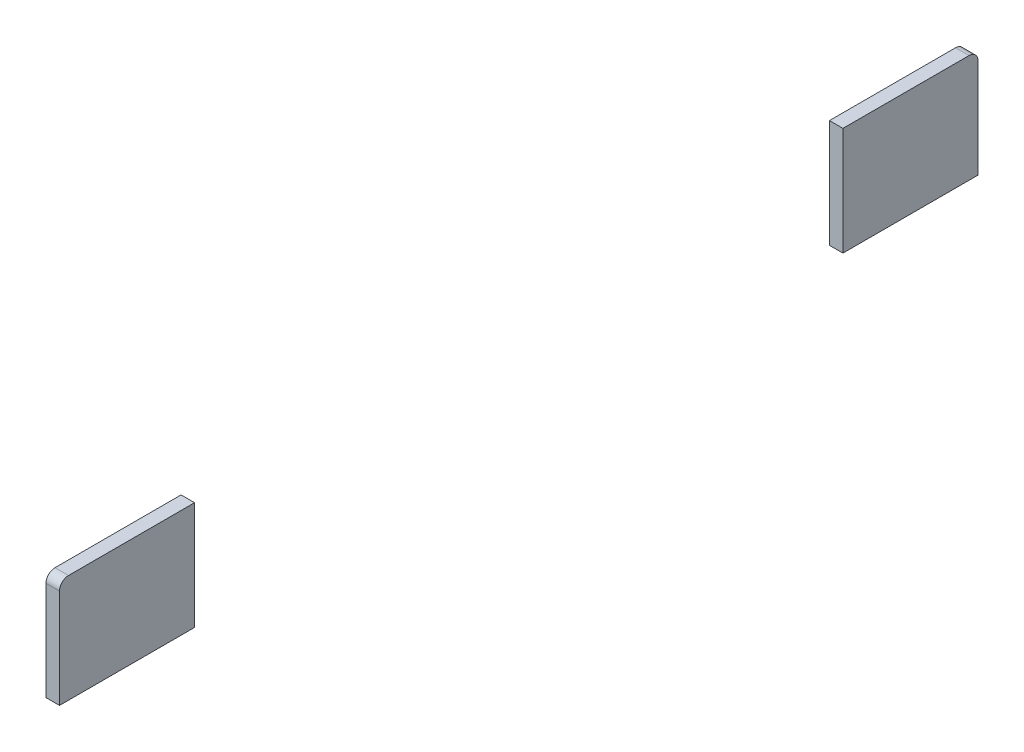
ISO-10303-21;
HEADER;
FILE_DESCRIPTION(('STEP AP214'),'2;1');
FILE_NAME('part.step','',(''),(''),'','','');
FILE_SCHEMA(('AUTOMOTIVE_DESIGN { 1 0 10303 214 1 1 1 1 }'));
ENDSEC;
DATA;
#1=APPLICATION_CONTEXT('core data for automotive mechanical design processes');
#2=APPLICATION_PROTOCOL_DEFINITION('international standard','automotive_design',2000,#1);
#3=PRODUCT_CONTEXT('',#1,'mechanical');
#4=PRODUCT('Part','Part','',(#3));
#5=PRODUCT_RELATED_PRODUCT_CATEGORY('part','',(#4));
#6=PRODUCT_DEFINITION_FORMATION('','',#4);
#7=PRODUCT_DEFINITION_CONTEXT('part definition',#1,'design');
#8=PRODUCT_DEFINITION('design','',#6,#7);
#9=PRODUCT_DEFINITION_SHAPE('','',#8);
#10=(LENGTH_UNIT() NAMED_UNIT(*) SI_UNIT(.MILLI.,.METRE.));
#11=(NAMED_UNIT(*) PLANE_ANGLE_UNIT() SI_UNIT($,.RADIAN.));
#12=(NAMED_UNIT(*) SI_UNIT($,.STERADIAN.) SOLID_ANGLE_UNIT());
#13=UNCERTAINTY_MEASURE_WITH_UNIT(LENGTH_MEASURE(1.E-05),#10,'distance_accuracy_value','');
#14=(GEOMETRIC_REPRESENTATION_CONTEXT(3) GLOBAL_UNCERTAINTY_ASSIGNED_CONTEXT((#13)) GLOBAL_UNIT_ASSIGNED_CONTEXT((#10,
#11,#12)) REPRESENTATION_CONTEXT('',''));
#15=CARTESIAN_POINT('',(0.,0.,0.));
#16=DIRECTION('',(0.,0.,1.));
#17=DIRECTION('',(1.,0.,0.));
#18=AXIS2_PLACEMENT_3D('',#15,#16,#17);
#19=CARTESIAN_POINT('',(1.5,0.,72.));
#20=DIRECTION('',(0.,0.,1.));
#21=DIRECTION('',(1.,0.,0.));
#22=AXIS2_PLACEMENT_3D('',#19,#20,#21);
#23=PLANE('',#22);
#24=DIRECTION('',(0.,1.,0.));
#25=VECTOR('',#24,1.);
#26=CARTESIAN_POINT('',(0.,0.,72.));
#27=LINE('',#26,#25);
#28=CARTESIAN_POINT('',(0.,0.,72.));
#29=VERTEX_POINT('',#28);
#30=CARTESIAN_POINT('',(0.,12.,72.));
#31=VERTEX_POINT('',#30);
#32=EDGE_CURVE('E117',#29,#31,#27,.T.);
#33=ORIENTED_EDGE('',*,*,#32,.T.);
#34=DIRECTION('',(-1.,0.,0.));
#35=VECTOR('',#34,1.);
#36=CARTESIAN_POINT('',(1.5,12.,72.));
#37=LINE('',#36,#35);
#38=CARTESIAN_POINT('',(1.5,12.,72.));
#39=VERTEX_POINT('',#38);
#40=EDGE_CURVE('E12',#39,#31,#37,.T.);
#41=ORIENTED_EDGE('',*,*,#40,.F.);
#42=DIRECTION('',(0.,1.,0.));
#43=VECTOR('',#42,1.);
#44=CARTESIAN_POINT('',(1.5,0.,72.));
#45=LINE('',#44,#43);
#46=CARTESIAN_POINT('',(1.5,0.,72.));
#47=VERTEX_POINT('',#46);
#48=EDGE_CURVE('E125',#47,#39,#45,.T.);
#49=ORIENTED_EDGE('',*,*,#48,.F.);
#50=DIRECTION('',(-1.,0.,0.));
#51=VECTOR('',#50,1.);
#52=CARTESIAN_POINT('',(1.5,0.,72.));
#53=LINE('',#52,#51);
#54=EDGE_CURVE('E113',#47,#29,#53,.T.);
#55=ORIENTED_EDGE('',*,*,#54,.T.);
#56=EDGE_LOOP('',(#33,#41,#49,#55));
#57=FACE_BOUND('',#56,.T.);
#58=ADVANCED_FACE('F43',(#57),#23,.F.);
#59=CARTESIAN_POINT('',(1.5,12.,72.));
#60=DIRECTION('',(0.,-1.,0.));
#61=DIRECTION('',(0.,0.,-1.));
#62=AXIS2_PLACEMENT_3D('',#59,#60,#61);
#63=PLANE('',#62);
#64=DIRECTION('',(0.,0.,1.));
#65=VECTOR('',#64,1.);
#66=CARTESIAN_POINT('',(0.,12.,72.));
#67=LINE('',#66,#65);
#68=CARTESIAN_POINT('',(0.,12.,86.));
#69=VERTEX_POINT('',#68);
#70=EDGE_CURVE('E120',#31,#69,#67,.T.);
#71=ORIENTED_EDGE('',*,*,#70,.T.);
#72=DIRECTION('',(-1.,0.,0.));
#73=VECTOR('',#72,1.);
#74=CARTESIAN_POINT('',(1.5,12.,86.));
#75=LINE('',#74,#73);
#76=CARTESIAN_POINT('',(1.5,12.,86.));
#77=VERTEX_POINT('',#76);
#78=EDGE_CURVE('E51',#77,#69,#75,.T.);
#79=ORIENTED_EDGE('',*,*,#78,.F.);
#80=DIRECTION('',(0.,0.,1.));
#81=VECTOR('',#80,1.);
#82=CARTESIAN_POINT('',(1.5,12.,72.));
#83=LINE('',#82,#81);
#84=EDGE_CURVE('E93',#39,#77,#83,.T.);
#85=ORIENTED_EDGE('',*,*,#84,.F.);
#86=ORIENTED_EDGE('',*,*,#40,.T.);
#87=EDGE_LOOP('',(#71,#79,#85,#86));
#88=FACE_BOUND('',#87,.T.);
#89=ADVANCED_FACE('F144',(#88),#63,.F.);
#90=CARTESIAN_POINT('',(1.5,11.,86.));
#91=DIRECTION('',(-1.,0.,0.));
#92=DIRECTION('',(0.,0.,1.));
#93=AXIS2_PLACEMENT_3D('',#90,#91,#92);
#94=CYLINDRICAL_SURFACE('',#93,1.);
#95=CARTESIAN_POINT('',(0.,11.,86.));
#96=DIRECTION('',(1.,0.,0.));
#97=DIRECTION('',(0.,0.,-1.));
#98=AXIS2_PLACEMENT_3D('',#95,#96,#97);
#99=CIRCLE('',#98,1.);
#100=CARTESIAN_POINT('',(0.,11.,87.));
#101=VERTEX_POINT('',#100);
#102=EDGE_CURVE('E108',#69,#101,#99,.T.);
#103=ORIENTED_EDGE('',*,*,#102,.T.);
#104=DIRECTION('',(-1.,0.,0.));
#105=VECTOR('',#104,1.);
#106=CARTESIAN_POINT('',(1.5,11.,87.));
#107=LINE('',#106,#105);
#108=CARTESIAN_POINT('',(1.5,11.,87.));
#109=VERTEX_POINT('',#108);
#110=EDGE_CURVE('E105',#109,#101,#107,.T.);
#111=ORIENTED_EDGE('',*,*,#110,.F.);
#112=CARTESIAN_POINT('',(1.5,11.,86.));
#113=DIRECTION('',(1.,0.,0.));
#114=DIRECTION('',(0.,0.,-1.));
#115=AXIS2_PLACEMENT_3D('',#112,#113,#114);
#116=CIRCLE('',#115,1.);
#117=EDGE_CURVE('E97',#77,#109,#116,.T.);
#118=ORIENTED_EDGE('',*,*,#117,.F.);
#119=ORIENTED_EDGE('',*,*,#78,.T.);
#120=EDGE_LOOP('',(#103,#111,#118,#119));
#121=FACE_BOUND('',#120,.T.);
#122=ADVANCED_FACE('F106',(#121),#94,.T.);
#123=CARTESIAN_POINT('',(1.5,0.,87.));
#124=DIRECTION('',(0.,0.,-1.));
#125=DIRECTION('',(-1.,0.,0.));
#126=AXIS2_PLACEMENT_3D('',#123,#124,#125);
#127=PLANE('',#126);
#128=DIRECTION('',(0.,-1.,0.));
#129=VECTOR('',#128,1.);
#130=CARTESIAN_POINT('',(0.,0.,87.));
#131=LINE('',#130,#129);
#132=CARTESIAN_POINT('',(0.,0.,87.));
#133=VERTEX_POINT('',#132);
#134=EDGE_CURVE('E79',#101,#133,#131,.T.);
#135=ORIENTED_EDGE('',*,*,#134,.T.);
#136=DIRECTION('',(-1.,0.,0.));
#137=VECTOR('',#136,1.);
#138=CARTESIAN_POINT('',(1.5,0.,87.));
#139=LINE('',#138,#137);
#140=CARTESIAN_POINT('',(1.5,0.,87.));
#141=VERTEX_POINT('',#140);
#142=EDGE_CURVE('E109',#141,#133,#139,.T.);
#143=ORIENTED_EDGE('',*,*,#142,.F.);
#144=DIRECTION('',(0.,-1.,0.));
#145=VECTOR('',#144,1.);
#146=CARTESIAN_POINT('',(1.5,0.,87.));
#147=LINE('',#146,#145);
#148=EDGE_CURVE('E101',#109,#141,#147,.T.);
#149=ORIENTED_EDGE('',*,*,#148,.F.);
#150=ORIENTED_EDGE('',*,*,#110,.T.);
#151=EDGE_LOOP('',(#135,#143,#149,#150));
#152=FACE_BOUND('',#151,.T.);
#153=ADVANCED_FACE('F111',(#152),#127,.F.);
#154=CARTESIAN_POINT('',(1.5,0.,72.));
#155=DIRECTION('',(0.,1.,0.));
#156=DIRECTION('',(0.,0.,1.));
#157=AXIS2_PLACEMENT_3D('',#154,#155,#156);
#158=PLANE('',#157);
#159=DIRECTION('',(0.,0.,-1.));
#160=VECTOR('',#159,1.);
#161=CARTESIAN_POINT('',(0.,0.,72.));
#162=LINE('',#161,#160);
#163=EDGE_CURVE('E85',#133,#29,#162,.T.);
#164=ORIENTED_EDGE('',*,*,#163,.T.);
#165=ORIENTED_EDGE('',*,*,#54,.F.);
#166=DIRECTION('',(0.,0.,-1.));
#167=VECTOR('',#166,1.);
#168=CARTESIAN_POINT('',(1.5,0.,72.));
#169=LINE('',#168,#167);
#170=EDGE_CURVE('E59',#141,#47,#169,.T.);
#171=ORIENTED_EDGE('',*,*,#170,.F.);
#172=ORIENTED_EDGE('',*,*,#142,.T.);
#173=EDGE_LOOP('',(#164,#165,#171,#172));
#174=FACE_BOUND('',#173,.T.);
#175=ADVANCED_FACE('F133',(#174),#158,.F.);
#176=CARTESIAN_POINT('',(1.5,11.,86.));
#177=DIRECTION('',(1.,0.,0.));
#178=DIRECTION('',(0.,0.,-1.));
#179=AXIS2_PLACEMENT_3D('',#176,#177,#178);
#180=PLANE('',#179);
#181=ORIENTED_EDGE('',*,*,#48,.T.);
#182=ORIENTED_EDGE('',*,*,#84,.T.);
#183=ORIENTED_EDGE('',*,*,#117,.T.);
#184=ORIENTED_EDGE('',*,*,#148,.T.);
#185=ORIENTED_EDGE('',*,*,#170,.T.);
#186=EDGE_LOOP('',(#181,#182,#183,#184,#185));
#187=FACE_BOUND('',#186,.T.);
#188=ADVANCED_FACE('F99',(#187),#180,.T.);
#189=CARTESIAN_POINT('',(0.,11.,86.));
#190=DIRECTION('',(1.,0.,0.));
#191=DIRECTION('',(0.,0.,-1.));
#192=AXIS2_PLACEMENT_3D('',#189,#190,#191);
#193=PLANE('',#192);
#194=ORIENTED_EDGE('',*,*,#32,.F.);
#195=ORIENTED_EDGE('',*,*,#163,.F.);
#196=ORIENTED_EDGE('',*,*,#134,.F.);
#197=ORIENTED_EDGE('',*,*,#102,.F.);
#198=ORIENTED_EDGE('',*,*,#70,.F.);
#199=EDGE_LOOP('',(#194,#195,#196,#197,#198));
#200=FACE_BOUND('',#199,.T.);
#201=ADVANCED_FACE('F129',(#200),#193,.F.);
#202=CLOSED_SHELL('',(#58,#89,#122,#153,#175,#188,#201));
#203=MANIFOLD_SOLID_BREP('B2',#202);
#204=CARTESIAN_POINT('',(1.5,0.,0.));
#205=DIRECTION('',(0.,0.,-1.));
#206=DIRECTION('',(-1.,0.,0.));
#207=AXIS2_PLACEMENT_3D('',#204,#205,#206);
#208=PLANE('',#207);
#209=DIRECTION('',(0.,-1.,0.));
#210=VECTOR('',#209,1.);
#211=CARTESIAN_POINT('',(0.,0.,0.));
#212=LINE('',#211,#210);
#213=CARTESIAN_POINT('',(0.,12.,0.));
#214=VERTEX_POINT('',#213);
#215=CARTESIAN_POINT('',(0.,0.,0.));
#216=VERTEX_POINT('',#215);
#217=EDGE_CURVE('E267',#214,#216,#212,.T.);
#218=ORIENTED_EDGE('',*,*,#217,.T.);
#219=DIRECTION('',(-1.,0.,0.));
#220=VECTOR('',#219,1.);
#221=CARTESIAN_POINT('',(1.5,0.,0.));
#222=LINE('',#221,#220);
#223=CARTESIAN_POINT('',(1.5,0.,0.));
#224=VERTEX_POINT('',#223);
#225=EDGE_CURVE('E41',#224,#216,#222,.T.);
#226=ORIENTED_EDGE('',*,*,#225,.F.);
#227=DIRECTION('',(0.,-1.,0.));
#228=VECTOR('',#227,1.);
#229=CARTESIAN_POINT('',(1.5,0.,0.));
#230=LINE('',#229,#228);
#231=CARTESIAN_POINT('',(1.5,12.,0.));
#232=VERTEX_POINT('',#231);
#233=EDGE_CURVE('E275',#232,#224,#230,.T.);
#234=ORIENTED_EDGE('',*,*,#233,.F.);
#235=DIRECTION('',(-1.,0.,0.));
#236=VECTOR('',#235,1.);
#237=CARTESIAN_POINT('',(1.5,12.,0.));
#238=LINE('',#237,#236);
#239=EDGE_CURVE('E263',#232,#214,#238,.T.);
#240=ORIENTED_EDGE('',*,*,#239,.T.);
#241=EDGE_LOOP('',(#218,#226,#234,#240));
#242=FACE_BOUND('',#241,.T.);
#243=ADVANCED_FACE('F193',(#242),#208,.F.);
#244=CARTESIAN_POINT('',(1.5,0.,0.));
#245=DIRECTION('',(0.,1.,0.));
#246=DIRECTION('',(0.,0.,1.));
#247=AXIS2_PLACEMENT_3D('',#244,#245,#246);
#248=PLANE('',#247);
#249=DIRECTION('',(0.,0.,-1.));
#250=VECTOR('',#249,1.);
#251=CARTESIAN_POINT('',(0.,0.,0.));
#252=LINE('',#251,#250);
#253=CARTESIAN_POINT('',(0.,0.,-15.));
#254=VERTEX_POINT('',#253);
#255=EDGE_CURVE('E270',#216,#254,#252,.T.);
#256=ORIENTED_EDGE('',*,*,#255,.T.);
#257=DIRECTION('',(-1.,0.,0.));
#258=VECTOR('',#257,1.);
#259=CARTESIAN_POINT('',(1.5,0.,-15.));
#260=LINE('',#259,#258);
#261=CARTESIAN_POINT('',(1.5,0.,-15.));
#262=VERTEX_POINT('',#261);
#263=EDGE_CURVE('E201',#262,#254,#260,.T.);
#264=ORIENTED_EDGE('',*,*,#263,.F.);
#265=DIRECTION('',(0.,0.,-1.));
#266=VECTOR('',#265,1.);
#267=CARTESIAN_POINT('',(1.5,0.,0.));
#268=LINE('',#267,#266);
#269=EDGE_CURVE('E243',#224,#262,#268,.T.);
#270=ORIENTED_EDGE('',*,*,#269,.F.);
#271=ORIENTED_EDGE('',*,*,#225,.T.);
#272=EDGE_LOOP('',(#256,#264,#270,#271));
#273=FACE_BOUND('',#272,.T.);
#274=ADVANCED_FACE('F294',(#273),#248,.F.);
#275=CARTESIAN_POINT('',(1.5,0.,-15.));
#276=DIRECTION('',(0.,0.,1.));
#277=DIRECTION('',(1.,0.,0.));
#278=AXIS2_PLACEMENT_3D('',#275,#276,#277);
#279=PLANE('',#278);
#280=DIRECTION('',(0.,1.,0.));
#281=VECTOR('',#280,1.);
#282=CARTESIAN_POINT('',(0.,0.,-15.));
#283=LINE('',#282,#281);
#284=CARTESIAN_POINT('',(0.,11.,-15.));
#285=VERTEX_POINT('',#284);
#286=EDGE_CURVE('E258',#254,#285,#283,.T.);
#287=ORIENTED_EDGE('',*,*,#286,.T.);
#288=DIRECTION('',(-1.,0.,0.));
#289=VECTOR('',#288,1.);
#290=CARTESIAN_POINT('',(1.5,11.,-15.));
#291=LINE('',#290,#289);
#292=CARTESIAN_POINT('',(1.5,11.,-15.));
#293=VERTEX_POINT('',#292);
#294=EDGE_CURVE('E255',#293,#285,#291,.T.);
#295=ORIENTED_EDGE('',*,*,#294,.F.);
#296=DIRECTION('',(0.,1.,0.));
#297=VECTOR('',#296,1.);
#298=CARTESIAN_POINT('',(1.5,0.,-15.));
#299=LINE('',#298,#297);
#300=EDGE_CURVE('E247',#262,#293,#299,.T.);
#301=ORIENTED_EDGE('',*,*,#300,.F.);
#302=ORIENTED_EDGE('',*,*,#263,.T.);
#303=EDGE_LOOP('',(#287,#295,#301,#302));
#304=FACE_BOUND('',#303,.T.);
#305=ADVANCED_FACE('F256',(#304),#279,.F.);
#306=CARTESIAN_POINT('',(1.5,11.,-14.));
#307=DIRECTION('',(-1.,0.,0.));
#308=DIRECTION('',(0.,0.,1.));
#309=AXIS2_PLACEMENT_3D('',#306,#307,#308);
#310=CYLINDRICAL_SURFACE('',#309,1.);
#311=CARTESIAN_POINT('',(0.,11.,-14.));
#312=DIRECTION('',(1.,0.,0.));
#313=DIRECTION('',(0.,0.,1.));
#314=AXIS2_PLACEMENT_3D('',#311,#312,#313);
#315=CIRCLE('',#314,1.);
#316=CARTESIAN_POINT('',(0.,12.,-14.));
#317=VERTEX_POINT('',#316);
#318=EDGE_CURVE('E229',#285,#317,#315,.T.);
#319=ORIENTED_EDGE('',*,*,#318,.T.);
#320=DIRECTION('',(-1.,0.,0.));
#321=VECTOR('',#320,1.);
#322=CARTESIAN_POINT('',(1.5,12.,-14.));
#323=LINE('',#322,#321);
#324=CARTESIAN_POINT('',(1.5,12.,-14.));
#325=VERTEX_POINT('',#324);
#326=EDGE_CURVE('E259',#325,#317,#323,.T.);
#327=ORIENTED_EDGE('',*,*,#326,.F.);
#328=CARTESIAN_POINT('',(1.5,11.,-14.));
#329=DIRECTION('',(1.,0.,0.));
#330=DIRECTION('',(0.,0.,1.));
#331=AXIS2_PLACEMENT_3D('',#328,#329,#330);
#332=CIRCLE('',#331,1.);
#333=EDGE_CURVE('E251',#293,#325,#332,.T.);
#334=ORIENTED_EDGE('',*,*,#333,.F.);
#335=ORIENTED_EDGE('',*,*,#294,.T.);
#336=EDGE_LOOP('',(#319,#327,#334,#335));
#337=FACE_BOUND('',#336,.T.);
#338=ADVANCED_FACE('F261',(#337),#310,.T.);
#339=CARTESIAN_POINT('',(1.5,12.,0.));
#340=DIRECTION('',(0.,-1.,0.));
#341=DIRECTION('',(0.,0.,-1.));
#342=AXIS2_PLACEMENT_3D('',#339,#340,#341);
#343=PLANE('',#342);
#344=DIRECTION('',(0.,0.,1.));
#345=VECTOR('',#344,1.);
#346=CARTESIAN_POINT('',(0.,12.,0.));
#347=LINE('',#346,#345);
#348=EDGE_CURVE('E235',#317,#214,#347,.T.);
#349=ORIENTED_EDGE('',*,*,#348,.T.);
#350=ORIENTED_EDGE('',*,*,#239,.F.);
#351=DIRECTION('',(0.,0.,1.));
#352=VECTOR('',#351,1.);
#353=CARTESIAN_POINT('',(1.5,12.,0.));
#354=LINE('',#353,#352);
#355=EDGE_CURVE('E209',#325,#232,#354,.T.);
#356=ORIENTED_EDGE('',*,*,#355,.F.);
#357=ORIENTED_EDGE('',*,*,#326,.T.);
#358=EDGE_LOOP('',(#349,#350,#356,#357));
#359=FACE_BOUND('',#358,.T.);
#360=ADVANCED_FACE('F283',(#359),#343,.F.);
#361=CARTESIAN_POINT('',(1.5,11.,-14.));
#362=DIRECTION('',(-1.,0.,0.));
#363=DIRECTION('',(0.,0.,1.));
#364=AXIS2_PLACEMENT_3D('',#361,#362,#363);
#365=PLANE('',#364);
#366=ORIENTED_EDGE('',*,*,#233,.T.);
#367=ORIENTED_EDGE('',*,*,#269,.T.);
#368=ORIENTED_EDGE('',*,*,#300,.T.);
#369=ORIENTED_EDGE('',*,*,#333,.T.);
#370=ORIENTED_EDGE('',*,*,#355,.T.);
#371=EDGE_LOOP('',(#366,#367,#368,#369,#370));
#372=FACE_BOUND('',#371,.T.);
#373=ADVANCED_FACE('F249',(#372),#365,.F.);
#374=CARTESIAN_POINT('',(0.,11.,-14.));
#375=DIRECTION('',(-1.,0.,0.));
#376=DIRECTION('',(0.,0.,1.));
#377=AXIS2_PLACEMENT_3D('',#374,#375,#376);
#378=PLANE('',#377);
#379=ORIENTED_EDGE('',*,*,#217,.F.);
#380=ORIENTED_EDGE('',*,*,#348,.F.);
#381=ORIENTED_EDGE('',*,*,#318,.F.);
#382=ORIENTED_EDGE('',*,*,#286,.F.);
#383=ORIENTED_EDGE('',*,*,#255,.F.);
#384=EDGE_LOOP('',(#379,#380,#381,#382,#383));
#385=FACE_BOUND('',#384,.T.);
#386=ADVANCED_FACE('F279',(#385),#378,.T.);
#387=CLOSED_SHELL('',(#243,#274,#305,#338,#360,#373,#386));
#388=MANIFOLD_SOLID_BREP('B6',#387);
#389=ADVANCED_BREP_SHAPE_REPRESENTATION('',(#18,#203,#388),#14);
#390=SHAPE_DEFINITION_REPRESENTATION(#9,#389);
ENDSEC;
END-ISO-10303-21;
